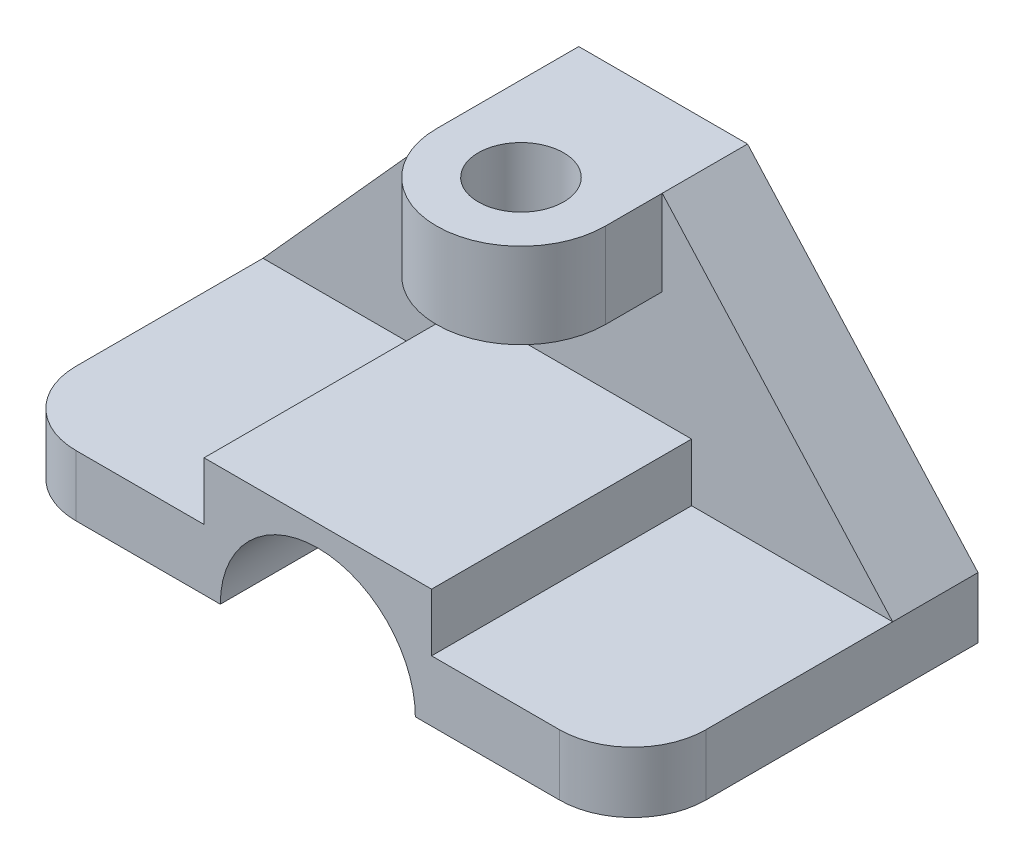
ISO-10303-21;
HEADER;
FILE_DESCRIPTION(('STEP AP214'),'2;1');
FILE_NAME('part.step','',(''),(''),'','','');
FILE_SCHEMA(('AUTOMOTIVE_DESIGN { 1 0 10303 214 1 1 1 1 }'));
ENDSEC;
DATA;
#1=APPLICATION_CONTEXT('core data for automotive mechanical design processes');
#2=APPLICATION_PROTOCOL_DEFINITION('international standard','automotive_design',2000,#1);
#3=PRODUCT_CONTEXT('',#1,'mechanical');
#4=PRODUCT('Part','Part','',(#3));
#5=PRODUCT_RELATED_PRODUCT_CATEGORY('part','',(#4));
#6=PRODUCT_DEFINITION_FORMATION('','',#4);
#7=PRODUCT_DEFINITION_CONTEXT('part definition',#1,'design');
#8=PRODUCT_DEFINITION('design','',#6,#7);
#9=PRODUCT_DEFINITION_SHAPE('','',#8);
#10=(LENGTH_UNIT() NAMED_UNIT(*) SI_UNIT(.MILLI.,.METRE.));
#11=(NAMED_UNIT(*) PLANE_ANGLE_UNIT() SI_UNIT($,.RADIAN.));
#12=(NAMED_UNIT(*) SI_UNIT($,.STERADIAN.) SOLID_ANGLE_UNIT());
#13=UNCERTAINTY_MEASURE_WITH_UNIT(LENGTH_MEASURE(1.E-05),#10,'distance_accuracy_value','');
#14=(GEOMETRIC_REPRESENTATION_CONTEXT(3) GLOBAL_UNCERTAINTY_ASSIGNED_CONTEXT((#13)) GLOBAL_UNIT_ASSIGNED_CONTEXT((#10,
#11,#12)) REPRESENTATION_CONTEXT('',''));
#15=CARTESIAN_POINT('',(0.,0.,0.));
#16=DIRECTION('',(0.,0.,1.));
#17=DIRECTION('',(1.,0.,0.));
#18=AXIS2_PLACEMENT_3D('',#15,#16,#17);
#19=CARTESIAN_POINT('',(0.,15.,85.));
#20=DIRECTION('',(0.,1.,0.));
#21=DIRECTION('',(-1.,0.,0.));
#22=AXIS2_PLACEMENT_3D('',#19,#20,#21);
#23=PLANE('',#22);
#24=DIRECTION('',(0.,0.,-1.));
#25=VECTOR('',#24,1.);
#26=CARTESIAN_POINT('',(-77.5,15.,85.));
#27=LINE('',#26,#25);
#28=CARTESIAN_POINT('',(-77.5,15.,67.));
#29=VERTEX_POINT('',#28);
#30=CARTESIAN_POINT('',(-77.5,15.,21.));
#31=VERTEX_POINT('',#30);
#32=EDGE_CURVE('E278',#29,#31,#27,.T.);
#33=ORIENTED_EDGE('',*,*,#32,.F.);
#34=CARTESIAN_POINT('',(-59.5,15.,67.));
#35=DIRECTION('',(0.,1.,0.));
#36=DIRECTION('',(-1.,0.,0.));
#37=AXIS2_PLACEMENT_3D('',#34,#35,#36);
#38=CIRCLE('',#37,18.);
#39=CARTESIAN_POINT('',(-59.5,15.,85.));
#40=VERTEX_POINT('',#39);
#41=EDGE_CURVE('E168',#29,#40,#38,.T.);
#42=ORIENTED_EDGE('',*,*,#41,.T.);
#43=DIRECTION('',(1.,0.,0.));
#44=VECTOR('',#43,1.);
#45=CARTESIAN_POINT('',(0.,15.,85.));
#46=LINE('',#45,#44);
#47=CARTESIAN_POINT('',(-28.,15.,85.));
#48=VERTEX_POINT('',#47);
#49=EDGE_CURVE('E257',#40,#48,#46,.T.);
#50=ORIENTED_EDGE('',*,*,#49,.T.);
#51=DIRECTION('',(0.,0.,-1.));
#52=VECTOR('',#51,1.);
#53=CARTESIAN_POINT('',(-28.,15.,85.));
#54=LINE('',#53,#52);
#55=CARTESIAN_POINT('',(-28.,15.,21.));
#56=VERTEX_POINT('',#55);
#57=EDGE_CURVE('E280',#48,#56,#54,.T.);
#58=ORIENTED_EDGE('',*,*,#57,.T.);
#59=DIRECTION('',(1.,0.,0.));
#60=VECTOR('',#59,1.);
#61=CARTESIAN_POINT('',(0.,15.,21.));
#62=LINE('',#61,#60);
#63=EDGE_CURVE('E223',#31,#56,#62,.T.);
#64=ORIENTED_EDGE('',*,*,#63,.F.);
#65=EDGE_LOOP('',(#33,#42,#50,#58,#64));
#66=FACE_BOUND('',#65,.T.);
#67=ADVANCED_FACE('F34',(#66),#23,.T.);
#68=CARTESIAN_POINT('',(-77.5,0.,85.));
#69=DIRECTION('',(-1.,0.,0.));
#70=DIRECTION('',(0.,0.,1.));
#71=AXIS2_PLACEMENT_3D('',#68,#69,#70);
#72=PLANE('',#71);
#73=DIRECTION('',(0.,0.,-1.));
#74=VECTOR('',#73,1.);
#75=CARTESIAN_POINT('',(-77.5,0.,85.));
#76=LINE('',#75,#74);
#77=CARTESIAN_POINT('',(-77.5,0.,67.));
#78=VERTEX_POINT('',#77);
#79=CARTESIAN_POINT('',(-77.5,0.,0.));
#80=VERTEX_POINT('',#79);
#81=EDGE_CURVE('E276',#78,#80,#76,.T.);
#82=ORIENTED_EDGE('',*,*,#81,.F.);
#83=DIRECTION('',(0.,1.,0.));
#84=VECTOR('',#83,1.);
#85=CARTESIAN_POINT('',(-77.5,-6.,67.));
#86=LINE('',#85,#84);
#87=EDGE_CURVE('E48',#78,#29,#86,.T.);
#88=ORIENTED_EDGE('',*,*,#87,.T.);
#89=ORIENTED_EDGE('',*,*,#32,.T.);
#90=DIRECTION('',(0.,0.,-1.));
#91=VECTOR('',#90,1.);
#92=CARTESIAN_POINT('',(-77.5,15.,21.));
#93=LINE('',#92,#91);
#94=CARTESIAN_POINT('',(-77.5,15.,0.));
#95=VERTEX_POINT('',#94);
#96=EDGE_CURVE('E227',#31,#95,#93,.T.);
#97=ORIENTED_EDGE('',*,*,#96,.T.);
#98=DIRECTION('',(0.,1.,0.));
#99=VECTOR('',#98,1.);
#100=CARTESIAN_POINT('',(-77.5,0.,0.));
#101=LINE('',#100,#99);
#102=EDGE_CURVE('E270',#80,#95,#101,.T.);
#103=ORIENTED_EDGE('',*,*,#102,.F.);
#104=EDGE_LOOP('',(#82,#88,#89,#97,#103));
#105=FACE_BOUND('',#104,.T.);
#106=ADVANCED_FACE('F385',(#105),#72,.T.);
#107=CARTESIAN_POINT('',(0.,0.,85.));
#108=DIRECTION('',(0.,1.,0.));
#109=DIRECTION('',(0.,0.,1.));
#110=AXIS2_PLACEMENT_3D('',#107,#108,#109);
#111=PLANE('',#110);
#112=CARTESIAN_POINT('',(-59.5,0.,67.));
#113=DIRECTION('',(0.,1.,0.));
#114=DIRECTION('',(0.,0.,1.));
#115=AXIS2_PLACEMENT_3D('',#112,#113,#114);
#116=CIRCLE('',#115,18.);
#117=CARTESIAN_POINT('',(-59.5,0.,85.));
#118=VERTEX_POINT('',#117);
#119=EDGE_CURVE('E11',#78,#118,#116,.T.);
#120=ORIENTED_EDGE('',*,*,#119,.F.);
#121=ORIENTED_EDGE('',*,*,#81,.T.);
#122=DIRECTION('',(1.,0.,0.));
#123=VECTOR('',#122,1.);
#124=CARTESIAN_POINT('',(0.,0.,0.));
#125=LINE('',#124,#123);
#126=CARTESIAN_POINT('',(-24.,0.,0.));
#127=VERTEX_POINT('',#126);
#128=EDGE_CURVE('E245',#80,#127,#125,.T.);
#129=ORIENTED_EDGE('',*,*,#128,.T.);
#130=DIRECTION('',(0.,0.,-1.));
#131=VECTOR('',#130,1.);
#132=CARTESIAN_POINT('',(-24.,0.,85.));
#133=LINE('',#132,#131);
#134=CARTESIAN_POINT('',(-24.,0.,85.));
#135=VERTEX_POINT('',#134);
#136=EDGE_CURVE('E261',#135,#127,#133,.T.);
#137=ORIENTED_EDGE('',*,*,#136,.F.);
#138=DIRECTION('',(1.,0.,0.));
#139=VECTOR('',#138,1.);
#140=CARTESIAN_POINT('',(0.,0.,85.));
#141=LINE('',#140,#139);
#142=EDGE_CURVE('E259',#118,#135,#141,.T.);
#143=ORIENTED_EDGE('',*,*,#142,.F.);
#144=EDGE_LOOP('',(#120,#121,#129,#137,#143));
#145=FACE_BOUND('',#144,.T.);
#146=ADVANCED_FACE('F329',(#145),#111,.F.);
#147=CARTESIAN_POINT('',(0.,0.,85.));
#148=DIRECTION('',(0.,1.,0.));
#149=DIRECTION('',(0.,0.,1.));
#150=AXIS2_PLACEMENT_3D('',#147,#148,#149);
#151=PLANE('',#150);
#152=CARTESIAN_POINT('',(59.5,0.,67.));
#153=DIRECTION('',(0.,1.,0.));
#154=DIRECTION('',(0.,0.,1.));
#155=AXIS2_PLACEMENT_3D('',#152,#153,#154);
#156=CIRCLE('',#155,18.);
#157=CARTESIAN_POINT('',(59.5,0.,85.));
#158=VERTEX_POINT('',#157);
#159=CARTESIAN_POINT('',(77.5,0.,67.));
#160=VERTEX_POINT('',#159);
#161=EDGE_CURVE('E199',#158,#160,#156,.T.);
#162=ORIENTED_EDGE('',*,*,#161,.F.);
#163=DIRECTION('',(1.,0.,0.));
#164=VECTOR('',#163,1.);
#165=CARTESIAN_POINT('',(0.,0.,85.));
#166=LINE('',#165,#164);
#167=CARTESIAN_POINT('',(24.,0.,85.));
#168=VERTEX_POINT('',#167);
#169=EDGE_CURVE('E244',#168,#158,#166,.T.);
#170=ORIENTED_EDGE('',*,*,#169,.F.);
#171=DIRECTION('',(0.,0.,-1.));
#172=VECTOR('',#171,1.);
#173=CARTESIAN_POINT('',(24.,0.,85.));
#174=LINE('',#173,#172);
#175=CARTESIAN_POINT('',(24.,0.,0.));
#176=VERTEX_POINT('',#175);
#177=EDGE_CURVE('E296',#168,#176,#174,.T.);
#178=ORIENTED_EDGE('',*,*,#177,.T.);
#179=DIRECTION('',(1.,0.,0.));
#180=VECTOR('',#179,1.);
#181=CARTESIAN_POINT('',(0.,0.,0.));
#182=LINE('',#181,#180);
#183=CARTESIAN_POINT('',(77.5,0.,0.));
#184=VERTEX_POINT('',#183);
#185=EDGE_CURVE('E264',#176,#184,#182,.T.);
#186=ORIENTED_EDGE('',*,*,#185,.T.);
#187=DIRECTION('',(0.,0.,-1.));
#188=VECTOR('',#187,1.);
#189=CARTESIAN_POINT('',(77.5,0.,85.));
#190=LINE('',#189,#188);
#191=EDGE_CURVE('E294',#160,#184,#190,.T.);
#192=ORIENTED_EDGE('',*,*,#191,.F.);
#193=EDGE_LOOP('',(#162,#170,#178,#186,#192));
#194=FACE_BOUND('',#193,.T.);
#195=ADVANCED_FACE('F336',(#194),#151,.F.);
#196=CARTESIAN_POINT('',(77.5,0.,85.));
#197=DIRECTION('',(-1.,0.,0.));
#198=DIRECTION('',(0.,0.,1.));
#199=AXIS2_PLACEMENT_3D('',#196,#197,#198);
#200=PLANE('',#199);
#201=DIRECTION('',(0.,1.,0.));
#202=VECTOR('',#201,1.);
#203=CARTESIAN_POINT('',(77.5,-6.,67.));
#204=LINE('',#203,#202);
#205=CARTESIAN_POINT('',(77.5,15.,67.));
#206=VERTEX_POINT('',#205);
#207=EDGE_CURVE('E197',#160,#206,#204,.T.);
#208=ORIENTED_EDGE('',*,*,#207,.F.);
#209=ORIENTED_EDGE('',*,*,#191,.T.);
#210=DIRECTION('',(0.,1.,0.));
#211=VECTOR('',#210,1.);
#212=CARTESIAN_POINT('',(77.5,0.,0.));
#213=LINE('',#212,#211);
#214=CARTESIAN_POINT('',(77.5,15.,0.));
#215=VERTEX_POINT('',#214);
#216=EDGE_CURVE('E267',#184,#215,#213,.T.);
#217=ORIENTED_EDGE('',*,*,#216,.T.);
#218=DIRECTION('',(0.,0.,-1.));
#219=VECTOR('',#218,1.);
#220=CARTESIAN_POINT('',(77.5,15.,21.));
#221=LINE('',#220,#219);
#222=CARTESIAN_POINT('',(77.5,15.,21.));
#223=VERTEX_POINT('',#222);
#224=EDGE_CURVE('E238',#223,#215,#221,.T.);
#225=ORIENTED_EDGE('',*,*,#224,.F.);
#226=DIRECTION('',(0.,0.,-1.));
#227=VECTOR('',#226,1.);
#228=CARTESIAN_POINT('',(77.5,15.,85.));
#229=LINE('',#228,#227);
#230=EDGE_CURVE('E292',#206,#223,#229,.T.);
#231=ORIENTED_EDGE('',*,*,#230,.F.);
#232=EDGE_LOOP('',(#208,#209,#217,#225,#231));
#233=FACE_BOUND('',#232,.T.);
#234=ADVANCED_FACE('F341',(#233),#200,.F.);
#235=CARTESIAN_POINT('',(0.,15.,85.));
#236=DIRECTION('',(0.,-1.,0.));
#237=DIRECTION('',(1.,0.,0.));
#238=AXIS2_PLACEMENT_3D('',#235,#236,#237);
#239=PLANE('',#238);
#240=CARTESIAN_POINT('',(59.5,15.,67.));
#241=DIRECTION('',(0.,1.,0.));
#242=DIRECTION('',(-1.,0.,0.));
#243=AXIS2_PLACEMENT_3D('',#240,#241,#242);
#244=CIRCLE('',#243,18.);
#245=CARTESIAN_POINT('',(59.5,15.,85.));
#246=VERTEX_POINT('',#245);
#247=EDGE_CURVE('E56',#246,#206,#244,.T.);
#248=ORIENTED_EDGE('',*,*,#247,.T.);
#249=ORIENTED_EDGE('',*,*,#230,.T.);
#250=DIRECTION('',(-1.,0.,0.));
#251=VECTOR('',#250,1.);
#252=CARTESIAN_POINT('',(0.,15.,21.));
#253=LINE('',#252,#251);
#254=CARTESIAN_POINT('',(28.,15.,21.));
#255=VERTEX_POINT('',#254);
#256=EDGE_CURVE('E209',#223,#255,#253,.T.);
#257=ORIENTED_EDGE('',*,*,#256,.T.);
#258=DIRECTION('',(0.,0.,-1.));
#259=VECTOR('',#258,1.);
#260=CARTESIAN_POINT('',(28.,15.,85.));
#261=LINE('',#260,#259);
#262=CARTESIAN_POINT('',(28.,15.,85.));
#263=VERTEX_POINT('',#262);
#264=EDGE_CURVE('E289',#263,#255,#261,.T.);
#265=ORIENTED_EDGE('',*,*,#264,.F.);
#266=DIRECTION('',(-1.,0.,0.));
#267=VECTOR('',#266,1.);
#268=CARTESIAN_POINT('',(0.,15.,85.));
#269=LINE('',#268,#267);
#270=EDGE_CURVE('E248',#246,#263,#269,.T.);
#271=ORIENTED_EDGE('',*,*,#270,.F.);
#272=EDGE_LOOP('',(#248,#249,#257,#265,#271));
#273=FACE_BOUND('',#272,.T.);
#274=ADVANCED_FACE('F306',(#273),#239,.F.);
#275=CARTESIAN_POINT('',(0.,0.,85.));
#276=DIRECTION('',(0.,0.,1.));
#277=DIRECTION('',(1.,0.,0.));
#278=AXIS2_PLACEMENT_3D('',#275,#276,#277);
#279=PLANE('',#278);
#280=DIRECTION('',(0.,1.,0.));
#281=VECTOR('',#280,1.);
#282=CARTESIAN_POINT('',(-59.5,-5.99999999999999,85.));
#283=LINE('',#282,#281);
#284=EDGE_CURVE('E193',#118,#40,#283,.T.);
#285=ORIENTED_EDGE('',*,*,#284,.F.);
#286=ORIENTED_EDGE('',*,*,#142,.T.);
#287=CARTESIAN_POINT('',(0.,0.,85.));
#288=DIRECTION('',(0.,0.,1.));
#289=DIRECTION('',(1.,0.,0.));
#290=AXIS2_PLACEMENT_3D('',#287,#288,#289);
#291=CIRCLE('',#290,24.);
#292=EDGE_CURVE('E241',#168,#135,#291,.T.);
#293=ORIENTED_EDGE('',*,*,#292,.F.);
#294=ORIENTED_EDGE('',*,*,#169,.T.);
#295=DIRECTION('',(0.,1.,0.));
#296=VECTOR('',#295,1.);
#297=CARTESIAN_POINT('',(59.5,-6.,85.));
#298=LINE('',#297,#296);
#299=EDGE_CURVE('E42',#158,#246,#298,.T.);
#300=ORIENTED_EDGE('',*,*,#299,.T.);
#301=ORIENTED_EDGE('',*,*,#270,.T.);
#302=DIRECTION('',(0.,1.,0.));
#303=VECTOR('',#302,1.);
#304=CARTESIAN_POINT('',(28.,0.,85.));
#305=LINE('',#304,#303);
#306=CARTESIAN_POINT('',(28.,29.2184786065606,85.));
#307=VERTEX_POINT('',#306);
#308=EDGE_CURVE('E250',#263,#307,#305,.T.);
#309=ORIENTED_EDGE('',*,*,#308,.T.);
#310=DIRECTION('',(-1.,0.,0.));
#311=VECTOR('',#310,1.);
#312=CARTESIAN_POINT('',(0.,29.2184786065606,85.));
#313=LINE('',#312,#311);
#314=CARTESIAN_POINT('',(-28.,29.2184786065606,85.));
#315=VERTEX_POINT('',#314);
#316=EDGE_CURVE('E252',#307,#315,#313,.T.);
#317=ORIENTED_EDGE('',*,*,#316,.T.);
#318=DIRECTION('',(0.,1.,0.));
#319=VECTOR('',#318,1.);
#320=CARTESIAN_POINT('',(-28.,0.,85.));
#321=LINE('',#320,#319);
#322=EDGE_CURVE('E254',#48,#315,#321,.T.);
#323=ORIENTED_EDGE('',*,*,#322,.F.);
#324=ORIENTED_EDGE('',*,*,#49,.F.);
#325=EDGE_LOOP('',(#285,#286,#293,#294,#300,#301,#309,#317,#323,#324));
#326=FACE_BOUND('',#325,.T.);
#327=ADVANCED_FACE('F300',(#326),#279,.T.);
#328=CARTESIAN_POINT('',(0.,0.,85.));
#329=DIRECTION('',(0.,0.,-1.));
#330=DIRECTION('',(-1.,0.,0.));
#331=AXIS2_PLACEMENT_3D('',#328,#329,#330);
#332=CYLINDRICAL_SURFACE('',#331,24.);
#333=CARTESIAN_POINT('',(0.,0.,0.));
#334=DIRECTION('',(0.,0.,1.));
#335=DIRECTION('',(1.,0.,0.));
#336=AXIS2_PLACEMENT_3D('',#333,#334,#335);
#337=CIRCLE('',#336,24.);
#338=EDGE_CURVE('E240',#176,#127,#337,.T.);
#339=ORIENTED_EDGE('',*,*,#338,.F.);
#340=ORIENTED_EDGE('',*,*,#177,.F.);
#341=ORIENTED_EDGE('',*,*,#292,.T.);
#342=ORIENTED_EDGE('',*,*,#136,.T.);
#343=EDGE_LOOP('',(#339,#340,#341,#342));
#344=FACE_BOUND('',#343,.T.);
#345=ADVANCED_FACE('F36',(#344),#332,.F.);
#346=CARTESIAN_POINT('',(28.,0.,85.));
#347=DIRECTION('',(-1.,0.,0.));
#348=DIRECTION('',(0.,0.,1.));
#349=AXIS2_PLACEMENT_3D('',#346,#347,#348);
#350=PLANE('',#349);
#351=ORIENTED_EDGE('',*,*,#264,.T.);
#352=DIRECTION('',(0.,1.,0.));
#353=VECTOR('',#352,1.);
#354=CARTESIAN_POINT('',(28.,0.,21.));
#355=LINE('',#354,#353);
#356=CARTESIAN_POINT('',(28.,29.2184786065606,21.));
#357=VERTEX_POINT('',#356);
#358=EDGE_CURVE('E205',#255,#357,#355,.T.);
#359=ORIENTED_EDGE('',*,*,#358,.T.);
#360=DIRECTION('',(0.,0.,-1.));
#361=VECTOR('',#360,1.);
#362=CARTESIAN_POINT('',(28.,29.2184786065606,85.));
#363=LINE('',#362,#361);
#364=EDGE_CURVE('E286',#307,#357,#363,.T.);
#365=ORIENTED_EDGE('',*,*,#364,.F.);
#366=ORIENTED_EDGE('',*,*,#308,.F.);
#367=EDGE_LOOP('',(#351,#359,#365,#366));
#368=FACE_BOUND('',#367,.T.);
#369=ADVANCED_FACE('F312',(#368),#350,.F.);
#370=CARTESIAN_POINT('',(0.,29.2184786065606,85.));
#371=DIRECTION('',(0.,-1.,0.));
#372=DIRECTION('',(0.,0.,-1.));
#373=AXIS2_PLACEMENT_3D('',#370,#371,#372);
#374=PLANE('',#373);
#375=ORIENTED_EDGE('',*,*,#364,.T.);
#376=DIRECTION('',(-1.,0.,0.));
#377=VECTOR('',#376,1.);
#378=CARTESIAN_POINT('',(0.,29.2184786065606,21.));
#379=LINE('',#378,#377);
#380=CARTESIAN_POINT('',(-28.,29.2184786065606,21.));
#381=VERTEX_POINT('',#380);
#382=EDGE_CURVE('E202',#357,#381,#379,.T.);
#383=ORIENTED_EDGE('',*,*,#382,.T.);
#384=DIRECTION('',(0.,0.,-1.));
#385=VECTOR('',#384,1.);
#386=CARTESIAN_POINT('',(-28.,29.2184786065606,85.));
#387=LINE('',#386,#385);
#388=EDGE_CURVE('E283',#315,#381,#387,.T.);
#389=ORIENTED_EDGE('',*,*,#388,.F.);
#390=ORIENTED_EDGE('',*,*,#316,.F.);
#391=EDGE_LOOP('',(#375,#383,#389,#390));
#392=FACE_BOUND('',#391,.T.);
#393=ADVANCED_FACE('F318',(#392),#374,.F.);
#394=CARTESIAN_POINT('',(-28.,0.,85.));
#395=DIRECTION('',(-1.,0.,0.));
#396=DIRECTION('',(0.,0.,1.));
#397=AXIS2_PLACEMENT_3D('',#394,#395,#396);
#398=PLANE('',#397);
#399=DIRECTION('',(0.,1.,0.));
#400=VECTOR('',#399,1.);
#401=CARTESIAN_POINT('',(-28.,0.,21.));
#402=LINE('',#401,#400);
#403=EDGE_CURVE('E225',#56,#381,#402,.T.);
#404=ORIENTED_EDGE('',*,*,#403,.F.);
#405=ORIENTED_EDGE('',*,*,#57,.F.);
#406=ORIENTED_EDGE('',*,*,#322,.T.);
#407=ORIENTED_EDGE('',*,*,#388,.T.);
#408=EDGE_LOOP('',(#404,#405,#406,#407));
#409=FACE_BOUND('',#408,.T.);
#410=ADVANCED_FACE('F322',(#409),#398,.T.);
#411=CARTESIAN_POINT('',(0.,0.,0.));
#412=DIRECTION('',(0.,0.,1.));
#413=DIRECTION('',(1.,0.,0.));
#414=AXIS2_PLACEMENT_3D('',#411,#412,#413);
#415=PLANE('',#414);
#416=DIRECTION('',(-1.,0.,0.));
#417=VECTOR('',#416,1.);
#418=CARTESIAN_POINT('',(20.7745452092364,78.,0.));
#419=LINE('',#418,#417);
#420=CARTESIAN_POINT('',(20.7745452092364,78.,0.));
#421=VERTEX_POINT('',#420);
#422=CARTESIAN_POINT('',(-20.7745452092364,78.,0.));
#423=VERTEX_POINT('',#422);
#424=EDGE_CURVE('E184',#421,#423,#419,.T.);
#425=ORIENTED_EDGE('',*,*,#424,.F.);
#426=DIRECTION('',(-0.669130606358856,0.743144825477396,0.));
#427=VECTOR('',#426,1.);
#428=CARTESIAN_POINT('',(50.2593921668838,45.2537599710131,0.));
#429=LINE('',#428,#427);
#430=EDGE_CURVE('E201',#215,#421,#429,.T.);
#431=ORIENTED_EDGE('',*,*,#430,.F.);
#432=ORIENTED_EDGE('',*,*,#216,.F.);
#433=ORIENTED_EDGE('',*,*,#185,.F.);
#434=ORIENTED_EDGE('',*,*,#338,.T.);
#435=ORIENTED_EDGE('',*,*,#128,.F.);
#436=ORIENTED_EDGE('',*,*,#102,.T.);
#437=DIRECTION('',(0.669130606358856,0.743144825477396,0.));
#438=VECTOR('',#437,1.);
#439=CARTESIAN_POINT('',(-50.2593921668838,45.2537599710131,0.));
#440=LINE('',#439,#438);
#441=EDGE_CURVE('E206',#95,#423,#440,.T.);
#442=ORIENTED_EDGE('',*,*,#441,.T.);
#443=EDGE_LOOP('',(#425,#431,#432,#433,#434,#435,#436,#442));
#444=FACE_BOUND('',#443,.T.);
#445=ADVANCED_FACE('F396',(#444),#415,.F.);
#446=CARTESIAN_POINT('',(50.2593921668838,45.2537599710131,21.));
#447=DIRECTION('',(-0.743144825477396,-0.669130606358856,0.));
#448=DIRECTION('',(0.669130606358856,-0.743144825477396,0.));
#449=AXIS2_PLACEMENT_3D('',#446,#447,#448);
#450=PLANE('',#449);
#451=ORIENTED_EDGE('',*,*,#430,.T.);
#452=DIRECTION('',(0.,0.,-1.));
#453=VECTOR('',#452,1.);
#454=CARTESIAN_POINT('',(20.7745452092364,78.,21.));
#455=LINE('',#454,#453);
#456=CARTESIAN_POINT('',(20.7745452092364,78.,21.));
#457=VERTEX_POINT('',#456);
#458=EDGE_CURVE('E235',#457,#421,#455,.T.);
#459=ORIENTED_EDGE('',*,*,#458,.F.);
#460=DIRECTION('',(-0.669130606358856,0.743144825477396,0.));
#461=VECTOR('',#460,1.);
#462=CARTESIAN_POINT('',(50.2593921668838,45.2537599710131,21.));
#463=LINE('',#462,#461);
#464=EDGE_CURVE('E212',#223,#457,#463,.T.);
#465=ORIENTED_EDGE('',*,*,#464,.F.);
#466=ORIENTED_EDGE('',*,*,#224,.T.);
#467=EDGE_LOOP('',(#451,#459,#465,#466));
#468=FACE_BOUND('',#467,.T.);
#469=ADVANCED_FACE('F346',(#468),#450,.F.);
#470=CARTESIAN_POINT('',(-50.2593921668838,45.2537599710131,21.));
#471=DIRECTION('',(-0.743144825477396,0.669130606358856,0.));
#472=DIRECTION('',(-0.669130606358856,-0.743144825477396,0.));
#473=AXIS2_PLACEMENT_3D('',#470,#471,#472);
#474=PLANE('',#473);
#475=ORIENTED_EDGE('',*,*,#441,.F.);
#476=ORIENTED_EDGE('',*,*,#96,.F.);
#477=DIRECTION('',(0.669130606358856,0.743144825477396,0.));
#478=VECTOR('',#477,1.);
#479=CARTESIAN_POINT('',(-50.2593921668838,45.2537599710131,21.));
#480=LINE('',#479,#478);
#481=CARTESIAN_POINT('',(-20.7745452092364,78.,21.));
#482=VERTEX_POINT('',#481);
#483=EDGE_CURVE('E220',#31,#482,#480,.T.);
#484=ORIENTED_EDGE('',*,*,#483,.T.);
#485=DIRECTION('',(0.,0.,-1.));
#486=VECTOR('',#485,1.);
#487=CARTESIAN_POINT('',(-20.7745452092364,78.,21.));
#488=LINE('',#487,#486);
#489=EDGE_CURVE('E233',#482,#423,#488,.T.);
#490=ORIENTED_EDGE('',*,*,#489,.T.);
#491=EDGE_LOOP('',(#475,#476,#484,#490));
#492=FACE_BOUND('',#491,.T.);
#493=ADVANCED_FACE('F354',(#492),#474,.T.);
#494=CARTESIAN_POINT('',(0.,0.,21.));
#495=DIRECTION('',(0.,0.,1.));
#496=DIRECTION('',(1.,0.,0.));
#497=AXIS2_PLACEMENT_3D('',#494,#495,#496);
#498=PLANE('',#497);
#499=ORIENTED_EDGE('',*,*,#382,.F.);
#500=ORIENTED_EDGE('',*,*,#358,.F.);
#501=ORIENTED_EDGE('',*,*,#256,.F.);
#502=ORIENTED_EDGE('',*,*,#464,.T.);
#503=DIRECTION('',(0.,-1.,0.));
#504=VECTOR('',#503,1.);
#505=CARTESIAN_POINT('',(20.7745452092364,0.,21.));
#506=LINE('',#505,#504);
#507=CARTESIAN_POINT('',(20.7745452092364,57.,21.));
#508=VERTEX_POINT('',#507);
#509=EDGE_CURVE('E214',#457,#508,#506,.T.);
#510=ORIENTED_EDGE('',*,*,#509,.T.);
#511=DIRECTION('',(1.,0.,0.));
#512=VECTOR('',#511,1.);
#513=CARTESIAN_POINT('',(0.,57.,21.));
#514=LINE('',#513,#512);
#515=CARTESIAN_POINT('',(-20.7745452092364,57.,21.));
#516=VERTEX_POINT('',#515);
#517=EDGE_CURVE('E217',#516,#508,#514,.T.);
#518=ORIENTED_EDGE('',*,*,#517,.F.);
#519=DIRECTION('',(0.,-1.,0.));
#520=VECTOR('',#519,1.);
#521=CARTESIAN_POINT('',(-20.7745452092364,0.,21.));
#522=LINE('',#521,#520);
#523=EDGE_CURVE('E182',#482,#516,#522,.T.);
#524=ORIENTED_EDGE('',*,*,#523,.F.);
#525=ORIENTED_EDGE('',*,*,#483,.F.);
#526=ORIENTED_EDGE('',*,*,#63,.T.);
#527=ORIENTED_EDGE('',*,*,#403,.T.);
#528=EDGE_LOOP('',(#499,#500,#501,#502,#510,#518,#524,#525,#526,#527));
#529=FACE_BOUND('',#528,.T.);
#530=ADVANCED_FACE('F350',(#529),#498,.T.);
#531=CARTESIAN_POINT('',(59.5,-6.,67.));
#532=DIRECTION('',(0.,1.,0.));
#533=DIRECTION('',(-1.,0.,0.));
#534=AXIS2_PLACEMENT_3D('',#531,#532,#533);
#535=CYLINDRICAL_SURFACE('',#534,18.);
#536=ORIENTED_EDGE('',*,*,#161,.T.);
#537=ORIENTED_EDGE('',*,*,#207,.T.);
#538=ORIENTED_EDGE('',*,*,#247,.F.);
#539=ORIENTED_EDGE('',*,*,#299,.F.);
#540=EDGE_LOOP('',(#536,#537,#538,#539));
#541=FACE_BOUND('',#540,.T.);
#542=ADVANCED_FACE('F339',(#541),#535,.T.);
#543=CARTESIAN_POINT('',(-59.5,-5.99999999999999,67.));
#544=DIRECTION('',(0.,1.,0.));
#545=DIRECTION('',(-1.,0.,0.));
#546=AXIS2_PLACEMENT_3D('',#543,#544,#545);
#547=CYLINDRICAL_SURFACE('',#546,18.);
#548=ORIENTED_EDGE('',*,*,#119,.T.);
#549=ORIENTED_EDGE('',*,*,#284,.T.);
#550=ORIENTED_EDGE('',*,*,#41,.F.);
#551=ORIENTED_EDGE('',*,*,#87,.F.);
#552=EDGE_LOOP('',(#548,#549,#550,#551));
#553=FACE_BOUND('',#552,.T.);
#554=ADVANCED_FACE('F423',(#553),#547,.T.);
#555=CARTESIAN_POINT('',(-20.7745452092364,78.,0.));
#556=DIRECTION('',(1.,0.,0.));
#557=DIRECTION('',(0.,0.,-1.));
#558=AXIS2_PLACEMENT_3D('',#555,#556,#557);
#559=PLANE('',#558);
#560=ORIENTED_EDGE('',*,*,#523,.T.);
#561=DIRECTION('',(0.,0.,1.));
#562=VECTOR('',#561,1.);
#563=CARTESIAN_POINT('',(-20.7745452092364,57.,0.));
#564=LINE('',#563,#562);
#565=CARTESIAN_POINT('',(-20.7745452092364,57.,35.));
#566=VERTEX_POINT('',#565);
#567=EDGE_CURVE('E175',#516,#566,#564,.T.);
#568=ORIENTED_EDGE('',*,*,#567,.T.);
#569=DIRECTION('',(0.,-1.,0.));
#570=VECTOR('',#569,1.);
#571=CARTESIAN_POINT('',(-20.7745452092363,78.,35.));
#572=LINE('',#571,#570);
#573=CARTESIAN_POINT('',(-20.7745452092364,78.,35.));
#574=VERTEX_POINT('',#573);
#575=EDGE_CURVE('E157',#574,#566,#572,.T.);
#576=ORIENTED_EDGE('',*,*,#575,.F.);
#577=DIRECTION('',(0.,0.,1.));
#578=VECTOR('',#577,1.);
#579=CARTESIAN_POINT('',(-20.7745452092364,78.,0.));
#580=LINE('',#579,#578);
#581=EDGE_CURVE('E356',#482,#574,#580,.T.);
#582=ORIENTED_EDGE('',*,*,#581,.F.);
#583=EDGE_LOOP('',(#560,#568,#576,#582));
#584=FACE_BOUND('',#583,.T.);
#585=ADVANCED_FACE('F181',(#584),#559,.F.);
#586=CARTESIAN_POINT('',(20.7745452092364,78.,35.));
#587=DIRECTION('',(-1.,0.,0.));
#588=DIRECTION('',(0.,0.,1.));
#589=AXIS2_PLACEMENT_3D('',#586,#587,#588);
#590=PLANE('',#589);
#591=ORIENTED_EDGE('',*,*,#509,.F.);
#592=DIRECTION('',(0.,0.,-1.));
#593=VECTOR('',#592,1.);
#594=CARTESIAN_POINT('',(20.7745452092364,78.,35.));
#595=LINE('',#594,#593);
#596=CARTESIAN_POINT('',(20.7745452092364,78.,35.));
#597=VERTEX_POINT('',#596);
#598=EDGE_CURVE('E187',#597,#457,#595,.T.);
#599=ORIENTED_EDGE('',*,*,#598,.F.);
#600=DIRECTION('',(0.,-1.,0.));
#601=VECTOR('',#600,1.);
#602=CARTESIAN_POINT('',(20.7745452092364,78.,35.));
#603=LINE('',#602,#601);
#604=CARTESIAN_POINT('',(20.7745452092364,57.,35.));
#605=VERTEX_POINT('',#604);
#606=EDGE_CURVE('E169',#597,#605,#603,.T.);
#607=ORIENTED_EDGE('',*,*,#606,.T.);
#608=DIRECTION('',(0.,0.,-1.));
#609=VECTOR('',#608,1.);
#610=CARTESIAN_POINT('',(20.7745452092364,57.,35.));
#611=LINE('',#610,#609);
#612=EDGE_CURVE('E177',#605,#508,#611,.T.);
#613=ORIENTED_EDGE('',*,*,#612,.T.);
#614=EDGE_LOOP('',(#591,#599,#607,#613));
#615=FACE_BOUND('',#614,.T.);
#616=ADVANCED_FACE('F428',(#615),#590,.F.);
#617=CARTESIAN_POINT('',(0.,78.,0.));
#618=DIRECTION('',(0.,1.,0.));
#619=DIRECTION('',(0.,0.,1.));
#620=AXIS2_PLACEMENT_3D('',#617,#618,#619);
#621=PLANE('',#620);
#622=CARTESIAN_POINT('',(0.,78.,35.));
#623=DIRECTION('',(0.,1.,0.));
#624=DIRECTION('',(0.,0.,1.));
#625=AXIS2_PLACEMENT_3D('',#622,#623,#624);
#626=CIRCLE('',#625,10.5);
#627=CARTESIAN_POINT('',(0.,78.,45.5));
#628=VERTEX_POINT('',#627);
#629=EDGE_CURVE('E366',#628,#628,#626,.T.);
#630=ORIENTED_EDGE('',*,*,#629,.F.);
#631=EDGE_LOOP('',(#630));
#632=FACE_BOUND('',#631,.T.);
#633=ORIENTED_EDGE('',*,*,#581,.T.);
#634=CARTESIAN_POINT('',(0.,78.,35.));
#635=DIRECTION('',(0.,1.,0.));
#636=DIRECTION('',(0.,0.,1.));
#637=AXIS2_PLACEMENT_3D('',#634,#635,#636);
#638=CIRCLE('',#637,20.7745452092364);
#639=EDGE_CURVE('E163',#574,#597,#638,.T.);
#640=ORIENTED_EDGE('',*,*,#639,.T.);
#641=ORIENTED_EDGE('',*,*,#598,.T.);
#642=ORIENTED_EDGE('',*,*,#458,.T.);
#643=ORIENTED_EDGE('',*,*,#424,.T.);
#644=ORIENTED_EDGE('',*,*,#489,.F.);
#645=EDGE_LOOP('',(#633,#640,#641,#642,#643,#644));
#646=FACE_BOUND('',#645,.T.);
#647=ADVANCED_FACE('F359',(#632,#646),#621,.T.);
#648=CARTESIAN_POINT('',(0.,57.,0.));
#649=DIRECTION('',(0.,1.,0.));
#650=DIRECTION('',(0.,0.,1.));
#651=AXIS2_PLACEMENT_3D('',#648,#649,#650);
#652=PLANE('',#651);
#653=CARTESIAN_POINT('',(0.,57.,35.));
#654=DIRECTION('',(0.,1.,0.));
#655=DIRECTION('',(0.,0.,1.));
#656=AXIS2_PLACEMENT_3D('',#653,#654,#655);
#657=CIRCLE('',#656,10.5);
#658=CARTESIAN_POINT('',(0.,57.,45.5));
#659=VERTEX_POINT('',#658);
#660=EDGE_CURVE('E178',#659,#659,#657,.T.);
#661=ORIENTED_EDGE('',*,*,#660,.T.);
#662=EDGE_LOOP('',(#661));
#663=FACE_BOUND('',#662,.T.);
#664=ORIENTED_EDGE('',*,*,#517,.T.);
#665=ORIENTED_EDGE('',*,*,#612,.F.);
#666=CARTESIAN_POINT('',(0.,57.,35.));
#667=DIRECTION('',(0.,1.,0.));
#668=DIRECTION('',(0.,0.,1.));
#669=AXIS2_PLACEMENT_3D('',#666,#667,#668);
#670=CIRCLE('',#669,20.7745452092364);
#671=EDGE_CURVE('E160',#566,#605,#670,.T.);
#672=ORIENTED_EDGE('',*,*,#671,.F.);
#673=ORIENTED_EDGE('',*,*,#567,.F.);
#674=EDGE_LOOP('',(#664,#665,#672,#673));
#675=FACE_BOUND('',#674,.T.);
#676=ADVANCED_FACE('F174',(#663,#675),#652,.F.);
#677=CARTESIAN_POINT('',(0.,57.,35.));
#678=DIRECTION('',(0.,1.,0.));
#679=DIRECTION('',(0.,0.,1.));
#680=AXIS2_PLACEMENT_3D('',#677,#678,#679);
#681=CYLINDRICAL_SURFACE('',#680,10.5);
#682=CARTESIAN_POINT('',(0.,78.,45.5));
#683=CARTESIAN_POINT('',(0.,77.78125,45.5));
#684=CARTESIAN_POINT('',(0.,77.5625,45.5));
#685=CARTESIAN_POINT('',(0.,77.125,45.5));
#686=CARTESIAN_POINT('',(0.,76.90625,45.5));
#687=CARTESIAN_POINT('',(0.,76.46875,45.5));
#688=CARTESIAN_POINT('',(0.,76.25,45.5));
#689=CARTESIAN_POINT('',(0.,75.8125,45.5));
#690=CARTESIAN_POINT('',(0.,75.59375,45.5));
#691=CARTESIAN_POINT('',(0.,75.15625,45.5));
#692=CARTESIAN_POINT('',(0.,74.9375,45.5));
#693=CARTESIAN_POINT('',(0.,74.5,45.5));
#694=CARTESIAN_POINT('',(0.,74.28125,45.5));
#695=CARTESIAN_POINT('',(0.,73.84375,45.5));
#696=CARTESIAN_POINT('',(0.,73.625,45.5));
#697=CARTESIAN_POINT('',(0.,73.1875,45.5));
#698=CARTESIAN_POINT('',(0.,72.96875,45.5));
#699=CARTESIAN_POINT('',(0.,72.53125,45.5));
#700=CARTESIAN_POINT('',(0.,72.3125,45.5));
#701=CARTESIAN_POINT('',(0.,71.875,45.5));
#702=CARTESIAN_POINT('',(0.,71.65625,45.5));
#703=CARTESIAN_POINT('',(0.,71.21875,45.5));
#704=CARTESIAN_POINT('',(0.,71.,45.5));
#705=CARTESIAN_POINT('',(0.,70.5625,45.5));
#706=CARTESIAN_POINT('',(0.,70.34375,45.5));
#707=CARTESIAN_POINT('',(0.,69.90625,45.5));
#708=CARTESIAN_POINT('',(0.,69.6875,45.5));
#709=CARTESIAN_POINT('',(0.,69.25,45.5));
#710=CARTESIAN_POINT('',(0.,69.03125,45.5));
#711=CARTESIAN_POINT('',(0.,68.59375,45.5));
#712=CARTESIAN_POINT('',(0.,68.375,45.5));
#713=CARTESIAN_POINT('',(0.,67.9375,45.5));
#714=CARTESIAN_POINT('',(0.,67.71875,45.5));
#715=CARTESIAN_POINT('',(0.,67.28125,45.5));
#716=CARTESIAN_POINT('',(0.,67.0625,45.5));
#717=CARTESIAN_POINT('',(0.,66.625,45.5));
#718=CARTESIAN_POINT('',(0.,66.40625,45.5));
#719=CARTESIAN_POINT('',(0.,65.96875,45.5));
#720=CARTESIAN_POINT('',(0.,65.75,45.5));
#721=CARTESIAN_POINT('',(0.,65.3125,45.5));
#722=CARTESIAN_POINT('',(0.,65.09375,45.5));
#723=CARTESIAN_POINT('',(0.,64.65625,45.5));
#724=CARTESIAN_POINT('',(0.,64.4375,45.5));
#725=CARTESIAN_POINT('',(0.,64.,45.5));
#726=CARTESIAN_POINT('',(0.,63.78125,45.5));
#727=CARTESIAN_POINT('',(0.,63.34375,45.5));
#728=CARTESIAN_POINT('',(0.,63.125,45.5));
#729=CARTESIAN_POINT('',(0.,62.6875,45.5));
#730=CARTESIAN_POINT('',(0.,62.46875,45.5));
#731=CARTESIAN_POINT('',(0.,62.03125,45.5));
#732=CARTESIAN_POINT('',(0.,61.8125,45.5));
#733=CARTESIAN_POINT('',(0.,61.375,45.5));
#734=CARTESIAN_POINT('',(0.,61.15625,45.5));
#735=CARTESIAN_POINT('',(0.,60.71875,45.5));
#736=CARTESIAN_POINT('',(0.,60.5,45.5));
#737=CARTESIAN_POINT('',(0.,60.0625,45.5));
#738=CARTESIAN_POINT('',(0.,59.84375,45.5));
#739=CARTESIAN_POINT('',(0.,59.40625,45.5));
#740=CARTESIAN_POINT('',(0.,59.1875,45.5));
#741=CARTESIAN_POINT('',(0.,58.75,45.5));
#742=CARTESIAN_POINT('',(0.,58.53125,45.5));
#743=CARTESIAN_POINT('',(0.,58.09375,45.5));
#744=CARTESIAN_POINT('',(0.,57.875,45.5));
#745=CARTESIAN_POINT('',(0.,57.4375,45.5));
#746=CARTESIAN_POINT('',(0.,57.21875,45.5));
#747=CARTESIAN_POINT('',(0.,57.,45.5));
#748=B_SPLINE_CURVE_WITH_KNOTS('',3,(#682,#683,#684,#685,#686,#687,#688,#689,#690,#691,#692,
#693,#694,#695,#696,#697,#698,#699,#700,#701,#702,#703,#704,#705,#706,#707,#708,#709,#710,#711,
#712,#713,#714,#715,#716,#717,#718,#719,#720,#721,#722,#723,#724,#725,#726,#727,#728,#729,#730,
#731,#732,#733,#734,#735,#736,#737,#738,#739,#740,#741,#742,#743,#744,#745,#746,#747),
.UNSPECIFIED.,.F.,.F.,(4,2,2,2,2,2,2,2,2,2,2,2,2,2,2,2,2,2,2,2,2,2,2,2,2,2,2,2,2,2,2,2,4),(0.,
0.656249999999997,1.31249999999999,1.96874999999999,2.625,3.28125,3.9375,4.59374999999999,
5.24999999999999,5.90624999999999,6.5625,7.21875,7.87499999999999,8.53124999999999,9.1875,
9.84375,10.5,11.15625,11.8125,12.46875,13.125,13.78125,14.4375,15.09375,15.75,16.40625,17.0625,
17.71875,18.375,19.03125,19.6875,20.34375,21.),.UNSPECIFIED.);
#749=EDGE_CURVE('BSEAM373',#628,#659,#748,.T.);
#750=ORIENTED_EDGE('',*,*,#629,.T.);
#751=ORIENTED_EDGE('',*,*,#660,.F.);
#752=ORIENTED_EDGE('',*,*,#749,.T.);
#753=ORIENTED_EDGE('',*,*,#749,.F.);
#754=EDGE_LOOP('',(#750,#752,#751,#753));
#755=FACE_BOUND('',#754,.T.);
#756=ADVANCED_FACE('F373',(#755),#681,.F.);
#757=CARTESIAN_POINT('',(0.,57.,35.));
#758=DIRECTION('',(0.,1.,0.));
#759=DIRECTION('',(0.,0.,1.));
#760=AXIS2_PLACEMENT_3D('',#757,#758,#759);
#761=CYLINDRICAL_SURFACE('',#760,20.7745452092364);
#762=ORIENTED_EDGE('',*,*,#575,.T.);
#763=ORIENTED_EDGE('',*,*,#671,.T.);
#764=ORIENTED_EDGE('',*,*,#606,.F.);
#765=ORIENTED_EDGE('',*,*,#639,.F.);
#766=EDGE_LOOP('',(#762,#763,#764,#765));
#767=FACE_BOUND('',#766,.T.);
#768=ADVANCED_FACE('F159',(#767),#761,.T.);
#769=CLOSED_SHELL('',(#67,#106,#146,#195,#234,#274,#327,#345,#369,#393,#410,#445,#469,#493,#530,
#542,#554,#585,#616,#647,#676,#756,#768));
#770=MANIFOLD_SOLID_BREP('B2',#769);
#771=ADVANCED_BREP_SHAPE_REPRESENTATION('',(#18,#770),#14);
#772=SHAPE_DEFINITION_REPRESENTATION(#9,#771);
ENDSEC;
END-ISO-10303-21;
